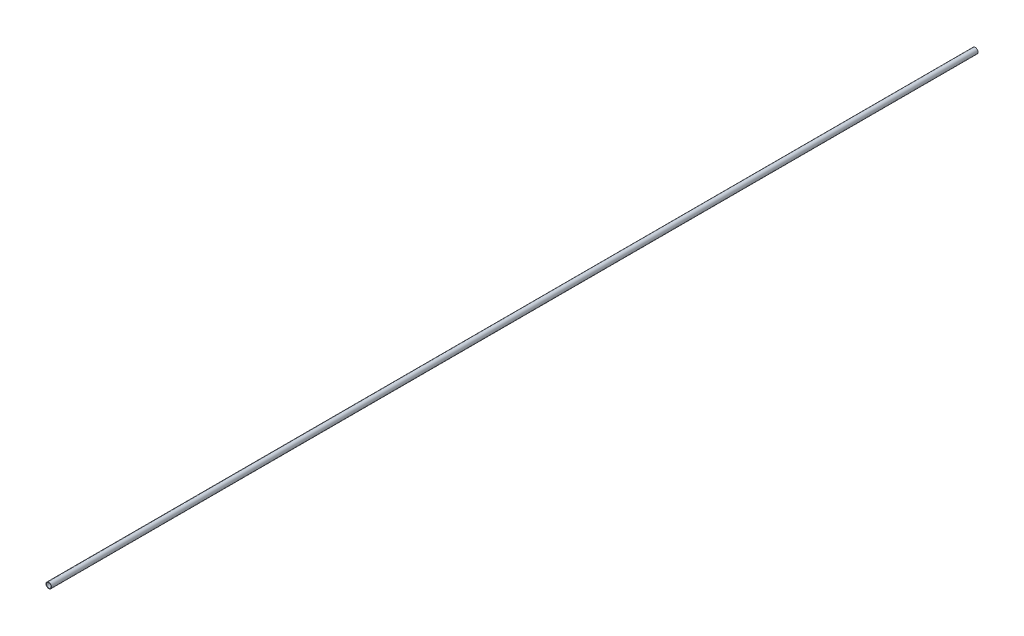
ISO-10303-21;
HEADER;
FILE_DESCRIPTION(('STEP AP214'),'2;1');
FILE_NAME('part.step','',(''),(''),'','','');
FILE_SCHEMA(('AUTOMOTIVE_DESIGN { 1 0 10303 214 1 1 1 1 }'));
ENDSEC;
DATA;
#1=APPLICATION_CONTEXT('core data for automotive mechanical design processes');
#2=APPLICATION_PROTOCOL_DEFINITION('international standard','automotive_design',2000,#1);
#3=PRODUCT_CONTEXT('',#1,'mechanical');
#4=PRODUCT('Part','Part','',(#3));
#5=PRODUCT_RELATED_PRODUCT_CATEGORY('part','',(#4));
#6=PRODUCT_DEFINITION_FORMATION('','',#4);
#7=PRODUCT_DEFINITION_CONTEXT('part definition',#1,'design');
#8=PRODUCT_DEFINITION('design','',#6,#7);
#9=PRODUCT_DEFINITION_SHAPE('','',#8);
#10=(LENGTH_UNIT() NAMED_UNIT(*) SI_UNIT(.MILLI.,.METRE.));
#11=(NAMED_UNIT(*) PLANE_ANGLE_UNIT() SI_UNIT($,.RADIAN.));
#12=(NAMED_UNIT(*) SI_UNIT($,.STERADIAN.) SOLID_ANGLE_UNIT());
#13=UNCERTAINTY_MEASURE_WITH_UNIT(LENGTH_MEASURE(1.E-05),#10,'distance_accuracy_value','');
#14=(GEOMETRIC_REPRESENTATION_CONTEXT(3) GLOBAL_UNCERTAINTY_ASSIGNED_CONTEXT((#13)) GLOBAL_UNIT_ASSIGNED_CONTEXT((#10,
#11,#12)) REPRESENTATION_CONTEXT('',''));
#15=CARTESIAN_POINT('',(0.,0.,0.));
#16=DIRECTION('',(0.,0.,1.));
#17=DIRECTION('',(1.,0.,0.));
#18=AXIS2_PLACEMENT_3D('',#15,#16,#17);
#19=CARTESIAN_POINT('',(0.,0.,500.));
#20=DIRECTION('',(0.,0.,-1.));
#21=DIRECTION('',(-1.,0.,0.));
#22=AXIS2_PLACEMENT_3D('',#19,#20,#21);
#23=CYLINDRICAL_SURFACE('',#22,3.);
#24=CARTESIAN_POINT('',(0.,0.,500.));
#25=DIRECTION('',(0.,0.,1.));
#26=DIRECTION('',(1.,0.,0.));
#27=AXIS2_PLACEMENT_3D('',#24,#25,#26);
#28=CIRCLE('',#27,3.);
#29=CARTESIAN_POINT('',(3.,0.,500.));
#30=VERTEX_POINT('',#29);
#31=EDGE_CURVE('E10',#30,#30,#28,.T.);
#32=ORIENTED_EDGE('',*,*,#31,.F.);
#33=EDGE_LOOP('',(#32));
#34=FACE_BOUND('',#33,.T.);
#35=CARTESIAN_POINT('',(0.,0.,-500.));
#36=DIRECTION('',(0.,0.,1.));
#37=DIRECTION('',(1.,0.,0.));
#38=AXIS2_PLACEMENT_3D('',#35,#36,#37);
#39=CIRCLE('',#38,3.);
#40=CARTESIAN_POINT('',(3.,0.,-500.));
#41=VERTEX_POINT('',#40);
#42=EDGE_CURVE('E46',#41,#41,#39,.T.);
#43=ORIENTED_EDGE('',*,*,#42,.T.);
#44=EDGE_LOOP('',(#43));
#45=FACE_BOUND('',#44,.T.);
#46=ADVANCED_FACE('F43',(#34,#45),#23,.T.);
#47=CARTESIAN_POINT('',(0.,0.,500.));
#48=DIRECTION('',(0.,0.,1.));
#49=DIRECTION('',(1.,0.,0.));
#50=AXIS2_PLACEMENT_3D('',#47,#48,#49);
#51=PLANE('',#50);
#52=CARTESIAN_POINT('',(0.,0.,500.));
#53=DIRECTION('',(0.,0.,1.));
#54=DIRECTION('',(1.,0.,0.));
#55=AXIS2_PLACEMENT_3D('',#52,#53,#54);
#56=CIRCLE('',#55,2.5);
#57=CARTESIAN_POINT('',(2.5,0.,500.));
#58=VERTEX_POINT('',#57);
#59=EDGE_CURVE('E55',#58,#58,#56,.T.);
#60=ORIENTED_EDGE('',*,*,#59,.F.);
#61=EDGE_LOOP('',(#60));
#62=FACE_BOUND('',#61,.T.);
#63=ORIENTED_EDGE('',*,*,#31,.T.);
#64=EDGE_LOOP('',(#63));
#65=FACE_BOUND('',#64,.T.);
#66=ADVANCED_FACE('F68',(#62,#65),#51,.T.);
#67=CARTESIAN_POINT('',(0.,0.,-500.));
#68=DIRECTION('',(0.,0.,1.));
#69=DIRECTION('',(1.,0.,0.));
#70=AXIS2_PLACEMENT_3D('',#67,#68,#69);
#71=PLANE('',#70);
#72=CARTESIAN_POINT('',(0.,0.,-500.));
#73=DIRECTION('',(0.,0.,1.));
#74=DIRECTION('',(1.,0.,0.));
#75=AXIS2_PLACEMENT_3D('',#72,#73,#74);
#76=CIRCLE('',#75,2.5);
#77=CARTESIAN_POINT('',(2.5,0.,-500.));
#78=VERTEX_POINT('',#77);
#79=EDGE_CURVE('E57',#78,#78,#76,.T.);
#80=ORIENTED_EDGE('',*,*,#79,.T.);
#81=EDGE_LOOP('',(#80));
#82=FACE_BOUND('',#81,.T.);
#83=ORIENTED_EDGE('',*,*,#42,.F.);
#84=EDGE_LOOP('',(#83));
#85=FACE_BOUND('',#84,.T.);
#86=ADVANCED_FACE('F70',(#82,#85),#71,.F.);
#87=CARTESIAN_POINT('',(0.,0.,500.));
#88=DIRECTION('',(0.,0.,-1.));
#89=DIRECTION('',(-1.,0.,0.));
#90=AXIS2_PLACEMENT_3D('',#87,#88,#89);
#91=CYLINDRICAL_SURFACE('',#90,2.5);
#92=ORIENTED_EDGE('',*,*,#59,.T.);
#93=EDGE_LOOP('',(#92));
#94=FACE_BOUND('',#93,.T.);
#95=ORIENTED_EDGE('',*,*,#79,.F.);
#96=EDGE_LOOP('',(#95));
#97=FACE_BOUND('',#96,.T.);
#98=ADVANCED_FACE('F65',(#94,#97),#91,.F.);
#99=CLOSED_SHELL('',(#46,#66,#86,#98));
#100=MANIFOLD_SOLID_BREP('B2',#99);
#101=ADVANCED_BREP_SHAPE_REPRESENTATION('',(#18,#100),#14);
#102=SHAPE_DEFINITION_REPRESENTATION(#9,#101);
ENDSEC;
END-ISO-10303-21;
